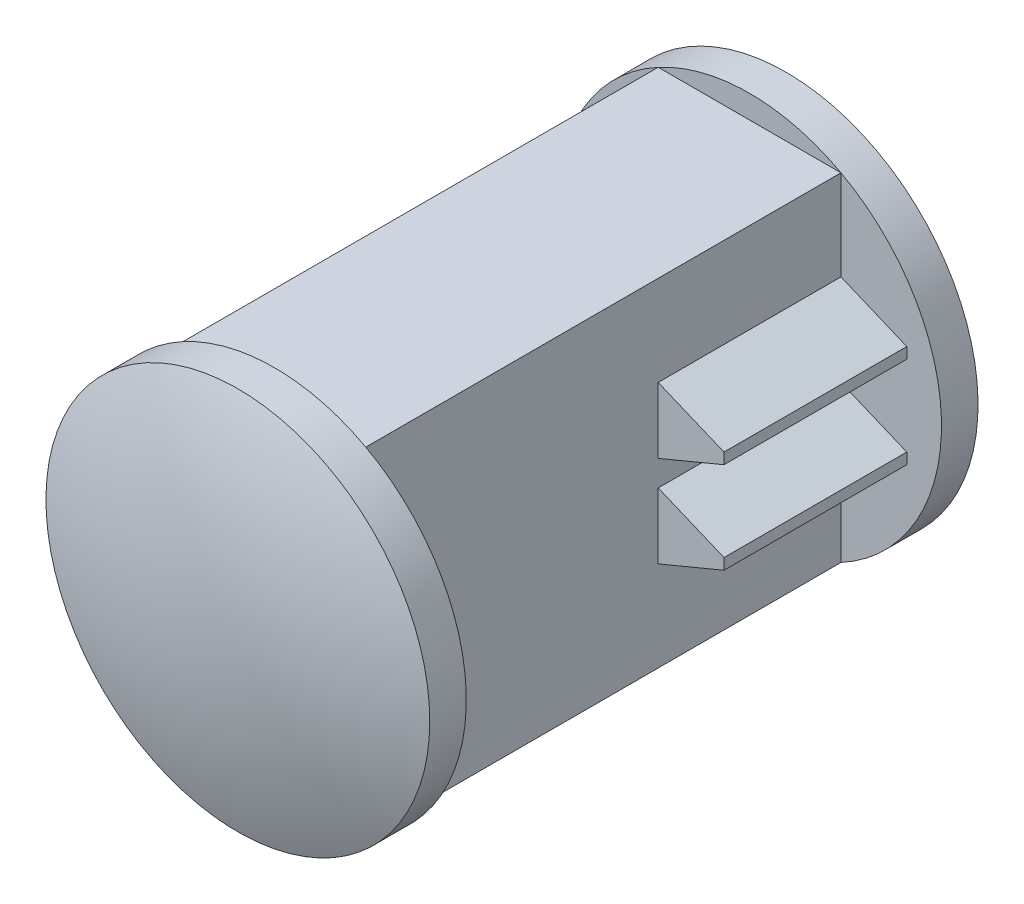
ISO-10303-21;
HEADER;
FILE_DESCRIPTION(('STEP AP214'),'2;1');
FILE_NAME('part.step','',(''),(''),'','','');
FILE_SCHEMA(('AUTOMOTIVE_DESIGN { 1 0 10303 214 1 1 1 1 }'));
ENDSEC;
DATA;
#1=APPLICATION_CONTEXT('core data for automotive mechanical design processes');
#2=APPLICATION_PROTOCOL_DEFINITION('international standard','automotive_design',2000,#1);
#3=PRODUCT_CONTEXT('',#1,'mechanical');
#4=PRODUCT('Part','Part','',(#3));
#5=PRODUCT_RELATED_PRODUCT_CATEGORY('part','',(#4));
#6=PRODUCT_DEFINITION_FORMATION('','',#4);
#7=PRODUCT_DEFINITION_CONTEXT('part definition',#1,'design');
#8=PRODUCT_DEFINITION('design','',#6,#7);
#9=PRODUCT_DEFINITION_SHAPE('','',#8);
#10=(LENGTH_UNIT() NAMED_UNIT(*) SI_UNIT(.MILLI.,.METRE.));
#11=(NAMED_UNIT(*) PLANE_ANGLE_UNIT() SI_UNIT($,.RADIAN.));
#12=(NAMED_UNIT(*) SI_UNIT($,.STERADIAN.) SOLID_ANGLE_UNIT());
#13=UNCERTAINTY_MEASURE_WITH_UNIT(LENGTH_MEASURE(1.E-05),#10,'distance_accuracy_value','');
#14=(GEOMETRIC_REPRESENTATION_CONTEXT(3) GLOBAL_UNCERTAINTY_ASSIGNED_CONTEXT((#13)) GLOBAL_UNIT_ASSIGNED_CONTEXT((#10,
#11,#12)) REPRESENTATION_CONTEXT('',''));
#15=CARTESIAN_POINT('',(0.,0.,0.));
#16=DIRECTION('',(0.,0.,1.));
#17=DIRECTION('',(1.,0.,0.));
#18=AXIS2_PLACEMENT_3D('',#15,#16,#17);
#19=CARTESIAN_POINT('',(2.5,-4.61654632815485,-13.));
#20=DIRECTION('',(-1.,0.,0.));
#21=DIRECTION('',(0.,0.,1.));
#22=AXIS2_PLACEMENT_3D('',#19,#20,#21);
#23=PLANE('',#22);
#24=DIRECTION('',(0.,-1.,0.));
#25=VECTOR('',#24,1.);
#26=CARTESIAN_POINT('',(2.5,-4.61654632815485,-13.));
#27=LINE('',#26,#25);
#28=CARTESIAN_POINT('',(2.5,-2.15,-13.));
#29=VERTEX_POINT('',#28);
#30=CARTESIAN_POINT('',(2.5,-4.61654632815485,-13.));
#31=VERTEX_POINT('',#30);
#32=EDGE_CURVE('E311',#29,#31,#27,.T.);
#33=ORIENTED_EDGE('',*,*,#32,.F.);
#34=DIRECTION('',(0.,0.,-1.));
#35=VECTOR('',#34,1.);
#36=CARTESIAN_POINT('',(2.5,-2.15,-8.));
#37=LINE('',#36,#35);
#38=CARTESIAN_POINT('',(2.5,-2.15,-8.));
#39=VERTEX_POINT('',#38);
#40=EDGE_CURVE('E199',#39,#29,#37,.T.);
#41=ORIENTED_EDGE('',*,*,#40,.F.);
#42=DIRECTION('',(0.,-1.,0.));
#43=VECTOR('',#42,1.);
#44=CARTESIAN_POINT('',(2.5,0.,-8.));
#45=LINE('',#44,#43);
#46=CARTESIAN_POINT('',(2.5,-0.35,-8.));
#47=VERTEX_POINT('',#46);
#48=EDGE_CURVE('E190',#47,#39,#45,.T.);
#49=ORIENTED_EDGE('',*,*,#48,.F.);
#50=DIRECTION('',(0.,0.,-1.));
#51=VECTOR('',#50,1.);
#52=CARTESIAN_POINT('',(2.5,-0.35,-8.));
#53=LINE('',#52,#51);
#54=CARTESIAN_POINT('',(2.5,-0.35,-13.));
#55=VERTEX_POINT('',#54);
#56=EDGE_CURVE('E205',#47,#55,#53,.T.);
#57=ORIENTED_EDGE('',*,*,#56,.T.);
#58=CARTESIAN_POINT('',(2.5,0.349999999999999,-13.));
#59=VERTEX_POINT('',#58);
#60=EDGE_CURVE('E310',#59,#55,#27,.T.);
#61=ORIENTED_EDGE('',*,*,#60,.F.);
#62=DIRECTION('',(0.,0.,-1.));
#63=VECTOR('',#62,1.);
#64=CARTESIAN_POINT('',(2.5,0.35,-8.));
#65=LINE('',#64,#63);
#66=CARTESIAN_POINT('',(2.5,0.35,-8.));
#67=VERTEX_POINT('',#66);
#68=EDGE_CURVE('E228',#67,#59,#65,.T.);
#69=ORIENTED_EDGE('',*,*,#68,.F.);
#70=DIRECTION('',(0.,-1.,0.));
#71=VECTOR('',#70,1.);
#72=CARTESIAN_POINT('',(2.5,0.,-8.));
#73=LINE('',#72,#71);
#74=CARTESIAN_POINT('',(2.5,2.15,-8.));
#75=VERTEX_POINT('',#74);
#76=EDGE_CURVE('E58',#75,#67,#73,.T.);
#77=ORIENTED_EDGE('',*,*,#76,.F.);
#78=DIRECTION('',(0.,0.,-1.));
#79=VECTOR('',#78,1.);
#80=CARTESIAN_POINT('',(2.5,2.15,-8.));
#81=LINE('',#80,#79);
#82=CARTESIAN_POINT('',(2.5,2.15,-13.));
#83=VERTEX_POINT('',#82);
#84=EDGE_CURVE('E231',#75,#83,#81,.T.);
#85=ORIENTED_EDGE('',*,*,#84,.T.);
#86=CARTESIAN_POINT('',(2.5,4.61654632815485,-13.));
#87=VERTEX_POINT('',#86);
#88=EDGE_CURVE('E306',#87,#83,#27,.T.);
#89=ORIENTED_EDGE('',*,*,#88,.F.);
#90=DIRECTION('',(0.,0.,1.));
#91=VECTOR('',#90,1.);
#92=CARTESIAN_POINT('',(2.5,4.61654632815485,-13.));
#93=LINE('',#92,#91);
#94=CARTESIAN_POINT('',(2.5,4.61654632815485,0.));
#95=VERTEX_POINT('',#94);
#96=EDGE_CURVE('E322',#87,#95,#93,.T.);
#97=ORIENTED_EDGE('',*,*,#96,.T.);
#98=DIRECTION('',(0.,-1.,0.));
#99=VECTOR('',#98,1.);
#100=CARTESIAN_POINT('',(2.5,-4.61654632815485,0.));
#101=LINE('',#100,#99);
#102=CARTESIAN_POINT('',(2.5,-4.61654632815485,0.));
#103=VERTEX_POINT('',#102);
#104=EDGE_CURVE('E301',#95,#103,#101,.T.);
#105=ORIENTED_EDGE('',*,*,#104,.T.);
#106=DIRECTION('',(0.,0.,1.));
#107=VECTOR('',#106,1.);
#108=CARTESIAN_POINT('',(2.5,-4.61654632815485,-13.));
#109=LINE('',#108,#107);
#110=EDGE_CURVE('E342',#31,#103,#109,.T.);
#111=ORIENTED_EDGE('',*,*,#110,.F.);
#112=EDGE_LOOP('',(#33,#41,#49,#57,#61,#69,#77,#85,#89,#97,#105,#111));
#113=FACE_BOUND('',#112,.T.);
#114=ADVANCED_FACE('F35',(#113),#23,.F.);
#115=CARTESIAN_POINT('',(0.,0.,-13.));
#116=DIRECTION('',(0.,0.,-1.));
#117=DIRECTION('',(-1.,0.,0.));
#118=AXIS2_PLACEMENT_3D('',#115,#116,#117);
#119=PLANE('',#118);
#120=DIRECTION('',(0.,-1.,0.));
#121=VECTOR('',#120,1.);
#122=CARTESIAN_POINT('',(4.3,0.,-13.));
#123=LINE('',#122,#121);
#124=CARTESIAN_POINT('',(4.3,-1.1,-13.));
#125=VERTEX_POINT('',#124);
#126=CARTESIAN_POINT('',(4.3,-1.4,-13.));
#127=VERTEX_POINT('',#126);
#128=EDGE_CURVE('E50',#125,#127,#123,.T.);
#129=ORIENTED_EDGE('',*,*,#128,.T.);
#130=DIRECTION('',(-0.923076923076923,-0.384615384615384,0.));
#131=VECTOR('',#130,1.);
#132=CARTESIAN_POINT('',(1.13313609467456,-2.71952662721893,-13.));
#133=LINE('',#132,#131);
#134=EDGE_CURVE('E178',#127,#29,#133,.T.);
#135=ORIENTED_EDGE('',*,*,#134,.T.);
#136=ORIENTED_EDGE('',*,*,#32,.T.);
#137=CARTESIAN_POINT('',(0.,0.,-13.));
#138=DIRECTION('',(0.,0.,-1.));
#139=DIRECTION('',(-1.,0.,0.));
#140=AXIS2_PLACEMENT_3D('',#137,#138,#139);
#141=CIRCLE('',#140,5.25);
#142=EDGE_CURVE('E305',#87,#31,#141,.T.);
#143=ORIENTED_EDGE('',*,*,#142,.F.);
#144=ORIENTED_EDGE('',*,*,#88,.T.);
#145=DIRECTION('',(-0.923076923076923,0.384615384615384,0.));
#146=VECTOR('',#145,1.);
#147=CARTESIAN_POINT('',(1.13313609467456,2.71952662721893,-13.));
#148=LINE('',#147,#146);
#149=CARTESIAN_POINT('',(4.3,1.4,-13.));
#150=VERTEX_POINT('',#149);
#151=EDGE_CURVE('E221',#150,#83,#148,.T.);
#152=ORIENTED_EDGE('',*,*,#151,.F.);
#153=DIRECTION('',(0.,1.,0.));
#154=VECTOR('',#153,1.);
#155=CARTESIAN_POINT('',(4.3,0.,-13.));
#156=LINE('',#155,#154);
#157=CARTESIAN_POINT('',(4.3,1.1,-13.));
#158=VERTEX_POINT('',#157);
#159=EDGE_CURVE('E180',#158,#150,#156,.T.);
#160=ORIENTED_EDGE('',*,*,#159,.F.);
#161=DIRECTION('',(0.923076923076923,0.384615384615385,0.));
#162=VECTOR('',#161,1.);
#163=CARTESIAN_POINT('',(0.245562130177515,-0.589349112426036,-13.));
#164=LINE('',#163,#162);
#165=EDGE_CURVE('E213',#59,#158,#164,.T.);
#166=ORIENTED_EDGE('',*,*,#165,.F.);
#167=ORIENTED_EDGE('',*,*,#60,.T.);
#168=DIRECTION('',(0.923076923076923,-0.384615384615385,0.));
#169=VECTOR('',#168,1.);
#170=CARTESIAN_POINT('',(0.245562130177515,0.589349112426036,-13.));
#171=LINE('',#170,#169);
#172=EDGE_CURVE('E191',#55,#125,#171,.T.);
#173=ORIENTED_EDGE('',*,*,#172,.T.);
#174=EDGE_LOOP('',(#129,#135,#136,#143,#144,#152,#160,#166,#167,#173));
#175=FACE_BOUND('',#174,.T.);
#176=ADVANCED_FACE('F382',(#175),#119,.F.);
#177=CARTESIAN_POINT('',(-2.5,-4.61654632815485,-13.));
#178=DIRECTION('',(1.,0.,0.));
#179=DIRECTION('',(0.,0.,-1.));
#180=AXIS2_PLACEMENT_3D('',#177,#178,#179);
#181=PLANE('',#180);
#182=DIRECTION('',(0.,0.,-1.));
#183=VECTOR('',#182,1.);
#184=CARTESIAN_POINT('',(-2.5,-2.15,-8.));
#185=LINE('',#184,#183);
#186=CARTESIAN_POINT('',(-2.5,-2.15,-8.));
#187=VERTEX_POINT('',#186);
#188=CARTESIAN_POINT('',(-2.5,-2.15,-13.));
#189=VERTEX_POINT('',#188);
#190=EDGE_CURVE('E262',#187,#189,#185,.T.);
#191=ORIENTED_EDGE('',*,*,#190,.T.);
#192=DIRECTION('',(0.,1.,0.));
#193=VECTOR('',#192,1.);
#194=CARTESIAN_POINT('',(-2.5,-4.61654632815485,-13.));
#195=LINE('',#194,#193);
#196=CARTESIAN_POINT('',(-2.5,-4.61654632815485,-13.));
#197=VERTEX_POINT('',#196);
#198=EDGE_CURVE('E315',#197,#189,#195,.T.);
#199=ORIENTED_EDGE('',*,*,#198,.F.);
#200=DIRECTION('',(0.,0.,1.));
#201=VECTOR('',#200,1.);
#202=CARTESIAN_POINT('',(-2.5,-4.61654632815485,-13.));
#203=LINE('',#202,#201);
#204=CARTESIAN_POINT('',(-2.5,-4.61654632815485,0.));
#205=VERTEX_POINT('',#204);
#206=EDGE_CURVE('E339',#197,#205,#203,.T.);
#207=ORIENTED_EDGE('',*,*,#206,.T.);
#208=DIRECTION('',(0.,1.,0.));
#209=VECTOR('',#208,1.);
#210=CARTESIAN_POINT('',(-2.5,-4.61654632815485,0.));
#211=LINE('',#210,#209);
#212=CARTESIAN_POINT('',(-2.5,4.61654632815485,0.));
#213=VERTEX_POINT('',#212);
#214=EDGE_CURVE('E328',#205,#213,#211,.T.);
#215=ORIENTED_EDGE('',*,*,#214,.T.);
#216=DIRECTION('',(0.,0.,1.));
#217=VECTOR('',#216,1.);
#218=CARTESIAN_POINT('',(-2.5,4.61654632815485,-13.));
#219=LINE('',#218,#217);
#220=CARTESIAN_POINT('',(-2.5,4.61654632815485,-13.));
#221=VERTEX_POINT('',#220);
#222=EDGE_CURVE('E336',#221,#213,#219,.T.);
#223=ORIENTED_EDGE('',*,*,#222,.F.);
#224=CARTESIAN_POINT('',(-2.5,2.15,-13.));
#225=VERTEX_POINT('',#224);
#226=EDGE_CURVE('E314',#225,#221,#195,.T.);
#227=ORIENTED_EDGE('',*,*,#226,.F.);
#228=DIRECTION('',(0.,0.,-1.));
#229=VECTOR('',#228,1.);
#230=CARTESIAN_POINT('',(-2.5,2.15,-8.));
#231=LINE('',#230,#229);
#232=CARTESIAN_POINT('',(-2.5,2.15,-8.));
#233=VERTEX_POINT('',#232);
#234=EDGE_CURVE('E280',#233,#225,#231,.T.);
#235=ORIENTED_EDGE('',*,*,#234,.F.);
#236=DIRECTION('',(0.,-1.,0.));
#237=VECTOR('',#236,1.);
#238=CARTESIAN_POINT('',(-2.5,0.,-8.));
#239=LINE('',#238,#237);
#240=CARTESIAN_POINT('',(-2.5,0.35,-8.));
#241=VERTEX_POINT('',#240);
#242=EDGE_CURVE('E277',#233,#241,#239,.T.);
#243=ORIENTED_EDGE('',*,*,#242,.T.);
#244=DIRECTION('',(0.,0.,-1.));
#245=VECTOR('',#244,1.);
#246=CARTESIAN_POINT('',(-2.5,0.35,-8.));
#247=LINE('',#246,#245);
#248=CARTESIAN_POINT('',(-2.5,0.35,-13.));
#249=VERTEX_POINT('',#248);
#250=EDGE_CURVE('E289',#241,#249,#247,.T.);
#251=ORIENTED_EDGE('',*,*,#250,.T.);
#252=CARTESIAN_POINT('',(-2.5,-0.350000000000001,-13.));
#253=VERTEX_POINT('',#252);
#254=EDGE_CURVE('E319',#253,#249,#195,.T.);
#255=ORIENTED_EDGE('',*,*,#254,.F.);
#256=DIRECTION('',(0.,0.,-1.));
#257=VECTOR('',#256,1.);
#258=CARTESIAN_POINT('',(-2.5,-0.35,-8.));
#259=LINE('',#258,#257);
#260=CARTESIAN_POINT('',(-2.5,-0.35,-8.));
#261=VERTEX_POINT('',#260);
#262=EDGE_CURVE('E259',#261,#253,#259,.T.);
#263=ORIENTED_EDGE('',*,*,#262,.F.);
#264=DIRECTION('',(0.,1.,0.));
#265=VECTOR('',#264,1.);
#266=CARTESIAN_POINT('',(-2.5,0.,-8.));
#267=LINE('',#266,#265);
#268=EDGE_CURVE('E244',#187,#261,#267,.T.);
#269=ORIENTED_EDGE('',*,*,#268,.F.);
#270=EDGE_LOOP('',(#191,#199,#207,#215,#223,#227,#235,#243,#251,#255,#263,#269));
#271=FACE_BOUND('',#270,.T.);
#272=ADVANCED_FACE('F378',(#271),#181,.F.);
#273=DIRECTION('',(0.923076923076923,-0.384615384615384,0.));
#274=VECTOR('',#273,1.);
#275=CARTESIAN_POINT('',(-1.13313609467456,-2.71952662721893,-13.));
#276=LINE('',#275,#274);
#277=CARTESIAN_POINT('',(-4.3,-1.4,-13.));
#278=VERTEX_POINT('',#277);
#279=EDGE_CURVE('E252',#278,#189,#276,.T.);
#280=ORIENTED_EDGE('',*,*,#279,.F.);
#281=DIRECTION('',(0.,-1.,0.));
#282=VECTOR('',#281,1.);
#283=CARTESIAN_POINT('',(-4.3,0.,-13.));
#284=LINE('',#283,#282);
#285=CARTESIAN_POINT('',(-4.3,-1.1,-13.));
#286=VERTEX_POINT('',#285);
#287=EDGE_CURVE('E236',#286,#278,#284,.T.);
#288=ORIENTED_EDGE('',*,*,#287,.F.);
#289=DIRECTION('',(-0.923076923076923,-0.384615384615385,0.));
#290=VECTOR('',#289,1.);
#291=CARTESIAN_POINT('',(-0.245562130177515,0.589349112426036,-13.));
#292=LINE('',#291,#290);
#293=EDGE_CURVE('E241',#253,#286,#292,.T.);
#294=ORIENTED_EDGE('',*,*,#293,.F.);
#295=ORIENTED_EDGE('',*,*,#254,.T.);
#296=DIRECTION('',(-0.923076923076923,0.384615384615385,0.));
#297=VECTOR('',#296,1.);
#298=CARTESIAN_POINT('',(-0.245562130177515,-0.589349112426036,-13.));
#299=LINE('',#298,#297);
#300=CARTESIAN_POINT('',(-4.3,1.1,-13.));
#301=VERTEX_POINT('',#300);
#302=EDGE_CURVE('E271',#249,#301,#299,.T.);
#303=ORIENTED_EDGE('',*,*,#302,.T.);
#304=DIRECTION('',(0.,1.,0.));
#305=VECTOR('',#304,1.);
#306=CARTESIAN_POINT('',(-4.3,0.,-13.));
#307=LINE('',#306,#305);
#308=CARTESIAN_POINT('',(-4.3,1.4,-13.));
#309=VERTEX_POINT('',#308);
#310=EDGE_CURVE('E283',#301,#309,#307,.T.);
#311=ORIENTED_EDGE('',*,*,#310,.T.);
#312=DIRECTION('',(0.923076923076923,0.384615384615384,0.));
#313=VECTOR('',#312,1.);
#314=CARTESIAN_POINT('',(-1.13313609467456,2.71952662721893,-13.));
#315=LINE('',#314,#313);
#316=EDGE_CURVE('E267',#309,#225,#315,.T.);
#317=ORIENTED_EDGE('',*,*,#316,.T.);
#318=ORIENTED_EDGE('',*,*,#226,.T.);
#319=EDGE_CURVE('E297',#197,#221,#141,.T.);
#320=ORIENTED_EDGE('',*,*,#319,.F.);
#321=ORIENTED_EDGE('',*,*,#198,.T.);
#322=EDGE_LOOP('',(#280,#288,#294,#295,#303,#311,#317,#318,#320,#321));
#323=FACE_BOUND('',#322,.T.);
#324=ADVANCED_FACE('F369',(#323),#119,.F.);
#325=CARTESIAN_POINT('',(0.,0.,0.));
#326=DIRECTION('',(0.,0.,1.));
#327=DIRECTION('',(1.,0.,0.));
#328=AXIS2_PLACEMENT_3D('',#325,#326,#327);
#329=PLANE('',#328);
#330=ORIENTED_EDGE('',*,*,#104,.F.);
#331=CARTESIAN_POINT('',(0.,0.,0.));
#332=DIRECTION('',(0.,0.,1.));
#333=DIRECTION('',(1.,0.,0.));
#334=AXIS2_PLACEMENT_3D('',#331,#332,#333);
#335=CIRCLE('',#334,5.25);
#336=EDGE_CURVE('E344',#103,#95,#335,.T.);
#337=ORIENTED_EDGE('',*,*,#336,.F.);
#338=EDGE_LOOP('',(#330,#337));
#339=FACE_BOUND('',#338,.T.);
#340=ADVANCED_FACE('F366',(#339),#329,.F.);
#341=DIRECTION('',(1.,0.,0.));
#342=VECTOR('',#341,1.);
#343=CARTESIAN_POINT('',(-2.5,4.61654632815485,0.));
#344=LINE('',#343,#342);
#345=EDGE_CURVE('E331',#213,#95,#344,.T.);
#346=ORIENTED_EDGE('',*,*,#345,.F.);
#347=EDGE_CURVE('E43',#95,#213,#335,.T.);
#348=ORIENTED_EDGE('',*,*,#347,.F.);
#349=EDGE_LOOP('',(#346,#348));
#350=FACE_BOUND('',#349,.T.);
#351=ADVANCED_FACE('F368',(#350),#329,.F.);
#352=ORIENTED_EDGE('',*,*,#214,.F.);
#353=EDGE_CURVE('E346',#213,#205,#335,.T.);
#354=ORIENTED_EDGE('',*,*,#353,.F.);
#355=EDGE_LOOP('',(#352,#354));
#356=FACE_BOUND('',#355,.T.);
#357=ADVANCED_FACE('F376',(#356),#329,.F.);
#358=DIRECTION('',(-1.,0.,0.));
#359=VECTOR('',#358,1.);
#360=CARTESIAN_POINT('',(-2.5,-4.61654632815485,0.));
#361=LINE('',#360,#359);
#362=EDGE_CURVE('E325',#103,#205,#361,.T.);
#363=ORIENTED_EDGE('',*,*,#362,.F.);
#364=EDGE_CURVE('E350',#205,#103,#335,.T.);
#365=ORIENTED_EDGE('',*,*,#364,.F.);
#366=EDGE_LOOP('',(#363,#365));
#367=FACE_BOUND('',#366,.T.);
#368=ADVANCED_FACE('F371',(#367),#329,.F.);
#369=CARTESIAN_POINT('',(0.,0.,1.));
#370=DIRECTION('',(0.,0.,-1.));
#371=DIRECTION('',(-1.,0.,0.));
#372=AXIS2_PLACEMENT_3D('',#369,#370,#371);
#373=CYLINDRICAL_SURFACE('',#372,5.25);
#374=CARTESIAN_POINT('',(0.,0.,1.));
#375=DIRECTION('',(0.,0.,1.));
#376=DIRECTION('',(1.,0.,0.));
#377=AXIS2_PLACEMENT_3D('',#374,#375,#376);
#378=CIRCLE('',#377,5.25);
#379=CARTESIAN_POINT('',(5.25,0.,1.));
#380=VERTEX_POINT('',#379);
#381=EDGE_CURVE('E11',#380,#380,#378,.T.);
#382=ORIENTED_EDGE('',*,*,#381,.F.);
#383=EDGE_LOOP('',(#382));
#384=FACE_BOUND('',#383,.T.);
#385=ORIENTED_EDGE('',*,*,#347,.T.);
#386=ORIENTED_EDGE('',*,*,#353,.T.);
#387=ORIENTED_EDGE('',*,*,#364,.T.);
#388=ORIENTED_EDGE('',*,*,#336,.T.);
#389=EDGE_LOOP('',(#385,#386,#387,#388));
#390=FACE_BOUND('',#389,.T.);
#391=ADVANCED_FACE('F354',(#384,#390),#373,.T.);
#392=CARTESIAN_POINT('',(0.,0.,-12.28125));
#393=DIRECTION('',(0.,0.,1.));
#394=DIRECTION('',(1.,0.,0.));
#395=AXIS2_PLACEMENT_3D('',#392,#393,#394);
#396=SPHERICAL_SURFACE('',#395,14.28125);
#397=ORIENTED_EDGE('',*,*,#381,.T.);
#398=EDGE_LOOP('',(#397));
#399=FACE_BOUND('',#398,.T.);
#400=ADVANCED_FACE('F37',(#399),#396,.T.);
#401=CARTESIAN_POINT('',(-2.5,-4.61654632815485,-13.));
#402=DIRECTION('',(0.,1.,0.));
#403=DIRECTION('',(0.,0.,1.));
#404=AXIS2_PLACEMENT_3D('',#401,#402,#403);
#405=PLANE('',#404);
#406=ORIENTED_EDGE('',*,*,#362,.T.);
#407=ORIENTED_EDGE('',*,*,#206,.F.);
#408=DIRECTION('',(-1.,0.,0.));
#409=VECTOR('',#408,1.);
#410=CARTESIAN_POINT('',(-2.5,-4.61654632815485,-13.));
#411=LINE('',#410,#409);
#412=EDGE_CURVE('E309',#31,#197,#411,.T.);
#413=ORIENTED_EDGE('',*,*,#412,.F.);
#414=ORIENTED_EDGE('',*,*,#110,.T.);
#415=EDGE_LOOP('',(#406,#407,#413,#414));
#416=FACE_BOUND('',#415,.T.);
#417=ADVANCED_FACE('F361',(#416),#405,.F.);
#418=CARTESIAN_POINT('',(-2.5,4.61654632815485,-13.));
#419=DIRECTION('',(0.,-1.,0.));
#420=DIRECTION('',(0.,0.,-1.));
#421=AXIS2_PLACEMENT_3D('',#418,#419,#420);
#422=PLANE('',#421);
#423=ORIENTED_EDGE('',*,*,#345,.T.);
#424=ORIENTED_EDGE('',*,*,#96,.F.);
#425=DIRECTION('',(1.,0.,0.));
#426=VECTOR('',#425,1.);
#427=CARTESIAN_POINT('',(-2.5,4.61654632815485,-13.));
#428=LINE('',#427,#426);
#429=EDGE_CURVE('E318',#221,#87,#428,.T.);
#430=ORIENTED_EDGE('',*,*,#429,.F.);
#431=ORIENTED_EDGE('',*,*,#222,.T.);
#432=EDGE_LOOP('',(#423,#424,#430,#431));
#433=FACE_BOUND('',#432,.T.);
#434=ADVANCED_FACE('F394',(#433),#422,.F.);
#435=EDGE_CURVE('E675',#31,#197,#141,.T.);
#436=ORIENTED_EDGE('',*,*,#435,.F.);
#437=ORIENTED_EDGE('',*,*,#412,.T.);
#438=EDGE_LOOP('',(#436,#437));
#439=FACE_BOUND('',#438,.T.);
#440=ADVANCED_FACE('F381',(#439),#119,.F.);
#441=EDGE_CURVE('E302',#221,#87,#141,.T.);
#442=ORIENTED_EDGE('',*,*,#441,.F.);
#443=ORIENTED_EDGE('',*,*,#429,.T.);
#444=EDGE_LOOP('',(#442,#443));
#445=FACE_BOUND('',#444,.T.);
#446=ADVANCED_FACE('F390',(#445),#119,.F.);
#447=CARTESIAN_POINT('',(0.,0.,-14.));
#448=DIRECTION('',(0.,0.,1.));
#449=DIRECTION('',(1.,0.,0.));
#450=AXIS2_PLACEMENT_3D('',#447,#448,#449);
#451=CYLINDRICAL_SURFACE('',#450,5.25);
#452=CARTESIAN_POINT('',(0.,0.,-14.));
#453=DIRECTION('',(0.,0.,-1.));
#454=DIRECTION('',(-1.,0.,0.));
#455=AXIS2_PLACEMENT_3D('',#452,#453,#454);
#456=CIRCLE('',#455,5.25);
#457=CARTESIAN_POINT('',(-5.25,0.,-14.));
#458=VERTEX_POINT('',#457);
#459=EDGE_CURVE('E298',#458,#458,#456,.T.);
#460=ORIENTED_EDGE('',*,*,#459,.F.);
#461=EDGE_LOOP('',(#460));
#462=FACE_BOUND('',#461,.T.);
#463=ORIENTED_EDGE('',*,*,#441,.T.);
#464=ORIENTED_EDGE('',*,*,#142,.T.);
#465=ORIENTED_EDGE('',*,*,#435,.T.);
#466=ORIENTED_EDGE('',*,*,#319,.T.);
#467=EDGE_LOOP('',(#463,#464,#465,#466));
#468=FACE_BOUND('',#467,.T.);
#469=ADVANCED_FACE('F401',(#462,#468),#451,.T.);
#470=CARTESIAN_POINT('',(0.,0.,-14.));
#471=DIRECTION('',(0.,0.,-1.));
#472=DIRECTION('',(-1.,0.,0.));
#473=AXIS2_PLACEMENT_3D('',#470,#471,#472);
#474=PLANE('',#473);
#475=ORIENTED_EDGE('',*,*,#459,.T.);
#476=EDGE_LOOP('',(#475));
#477=FACE_BOUND('',#476,.T.);
#478=ADVANCED_FACE('F403',(#477),#474,.T.);
#479=CARTESIAN_POINT('',(-1.13313609467456,2.71952662721893,-8.));
#480=DIRECTION('',(-0.384615384615384,0.923076923076923,0.));
#481=DIRECTION('',(-0.923076923076923,-0.384615384615384,0.));
#482=AXIS2_PLACEMENT_3D('',#479,#480,#481);
#483=PLANE('',#482);
#484=ORIENTED_EDGE('',*,*,#316,.F.);
#485=DIRECTION('',(0.,0.,-1.));
#486=VECTOR('',#485,1.);
#487=CARTESIAN_POINT('',(-4.3,1.4,-8.));
#488=LINE('',#487,#486);
#489=CARTESIAN_POINT('',(-4.3,1.4,-8.));
#490=VERTEX_POINT('',#489);
#491=EDGE_CURVE('E295',#490,#309,#488,.T.);
#492=ORIENTED_EDGE('',*,*,#491,.F.);
#493=DIRECTION('',(0.923076923076923,0.384615384615384,0.));
#494=VECTOR('',#493,1.);
#495=CARTESIAN_POINT('',(-1.13313609467456,2.71952662721893,-8.));
#496=LINE('',#495,#494);
#497=EDGE_CURVE('E268',#490,#233,#496,.T.);
#498=ORIENTED_EDGE('',*,*,#497,.T.);
#499=ORIENTED_EDGE('',*,*,#234,.T.);
#500=EDGE_LOOP('',(#484,#492,#498,#499));
#501=FACE_BOUND('',#500,.T.);
#502=ADVANCED_FACE('F408',(#501),#483,.T.);
#503=CARTESIAN_POINT('',(-4.3,0.,-8.));
#504=DIRECTION('',(-1.,0.,0.));
#505=DIRECTION('',(0.,-1.,0.));
#506=AXIS2_PLACEMENT_3D('',#503,#504,#505);
#507=PLANE('',#506);
#508=ORIENTED_EDGE('',*,*,#310,.F.);
#509=DIRECTION('',(0.,0.,-1.));
#510=VECTOR('',#509,1.);
#511=CARTESIAN_POINT('',(-4.3,1.1,-8.));
#512=LINE('',#511,#510);
#513=CARTESIAN_POINT('',(-4.3,1.1,-8.));
#514=VERTEX_POINT('',#513);
#515=EDGE_CURVE('E292',#514,#301,#512,.T.);
#516=ORIENTED_EDGE('',*,*,#515,.F.);
#517=DIRECTION('',(0.,1.,0.));
#518=VECTOR('',#517,1.);
#519=CARTESIAN_POINT('',(-4.3,0.,-8.));
#520=LINE('',#519,#518);
#521=EDGE_CURVE('E270',#514,#490,#520,.T.);
#522=ORIENTED_EDGE('',*,*,#521,.T.);
#523=ORIENTED_EDGE('',*,*,#491,.T.);
#524=EDGE_LOOP('',(#508,#516,#522,#523));
#525=FACE_BOUND('',#524,.T.);
#526=ADVANCED_FACE('F412',(#525),#507,.T.);
#527=CARTESIAN_POINT('',(-0.245562130177515,-0.589349112426036,-8.));
#528=DIRECTION('',(-0.384615384615385,-0.923076923076923,0.));
#529=DIRECTION('',(0.923076923076923,-0.384615384615385,0.));
#530=AXIS2_PLACEMENT_3D('',#527,#528,#529);
#531=PLANE('',#530);
#532=ORIENTED_EDGE('',*,*,#302,.F.);
#533=ORIENTED_EDGE('',*,*,#250,.F.);
#534=DIRECTION('',(-0.923076923076923,0.384615384615385,0.));
#535=VECTOR('',#534,1.);
#536=CARTESIAN_POINT('',(-0.245562130177515,-0.589349112426036,-8.));
#537=LINE('',#536,#535);
#538=EDGE_CURVE('E274',#241,#514,#537,.T.);
#539=ORIENTED_EDGE('',*,*,#538,.T.);
#540=ORIENTED_EDGE('',*,*,#515,.T.);
#541=EDGE_LOOP('',(#532,#533,#539,#540));
#542=FACE_BOUND('',#541,.T.);
#543=ADVANCED_FACE('F416',(#542),#531,.T.);
#544=CARTESIAN_POINT('',(0.,0.,-8.));
#545=DIRECTION('',(0.,0.,1.));
#546=DIRECTION('',(1.,0.,0.));
#547=AXIS2_PLACEMENT_3D('',#544,#545,#546);
#548=PLANE('',#547);
#549=ORIENTED_EDGE('',*,*,#497,.F.);
#550=ORIENTED_EDGE('',*,*,#521,.F.);
#551=ORIENTED_EDGE('',*,*,#538,.F.);
#552=ORIENTED_EDGE('',*,*,#242,.F.);
#553=EDGE_LOOP('',(#549,#550,#551,#552));
#554=FACE_BOUND('',#553,.T.);
#555=ADVANCED_FACE('F420',(#554),#548,.T.);
#556=CARTESIAN_POINT('',(-4.3,0.,-8.));
#557=DIRECTION('',(1.,0.,0.));
#558=DIRECTION('',(0.,1.,0.));
#559=AXIS2_PLACEMENT_3D('',#556,#557,#558);
#560=PLANE('',#559);
#561=ORIENTED_EDGE('',*,*,#287,.T.);
#562=DIRECTION('',(0.,0.,-1.));
#563=VECTOR('',#562,1.);
#564=CARTESIAN_POINT('',(-4.3,-1.4,-8.));
#565=LINE('',#564,#563);
#566=CARTESIAN_POINT('',(-4.3,-1.4,-8.));
#567=VERTEX_POINT('',#566);
#568=EDGE_CURVE('E264',#567,#278,#565,.T.);
#569=ORIENTED_EDGE('',*,*,#568,.F.);
#570=DIRECTION('',(0.,-1.,0.));
#571=VECTOR('',#570,1.);
#572=CARTESIAN_POINT('',(-4.3,0.,-8.));
#573=LINE('',#572,#571);
#574=CARTESIAN_POINT('',(-4.3,-1.1,-8.));
#575=VERTEX_POINT('',#574);
#576=EDGE_CURVE('E237',#575,#567,#573,.T.);
#577=ORIENTED_EDGE('',*,*,#576,.F.);
#578=DIRECTION('',(0.,0.,-1.));
#579=VECTOR('',#578,1.);
#580=CARTESIAN_POINT('',(-4.3,-1.1,-8.));
#581=LINE('',#580,#579);
#582=EDGE_CURVE('E249',#575,#286,#581,.T.);
#583=ORIENTED_EDGE('',*,*,#582,.T.);
#584=EDGE_LOOP('',(#561,#569,#577,#583));
#585=FACE_BOUND('',#584,.T.);
#586=ADVANCED_FACE('F424',(#585),#560,.F.);
#587=CARTESIAN_POINT('',(-1.13313609467456,-2.71952662721893,-8.));
#588=DIRECTION('',(0.384615384615384,0.923076923076923,0.));
#589=DIRECTION('',(-0.923076923076923,0.384615384615384,0.));
#590=AXIS2_PLACEMENT_3D('',#587,#588,#589);
#591=PLANE('',#590);
#592=ORIENTED_EDGE('',*,*,#279,.T.);
#593=ORIENTED_EDGE('',*,*,#190,.F.);
#594=DIRECTION('',(0.923076923076923,-0.384615384615384,0.));
#595=VECTOR('',#594,1.);
#596=CARTESIAN_POINT('',(-1.13313609467456,-2.71952662721893,-8.));
#597=LINE('',#596,#595);
#598=EDGE_CURVE('E240',#567,#187,#597,.T.);
#599=ORIENTED_EDGE('',*,*,#598,.F.);
#600=ORIENTED_EDGE('',*,*,#568,.T.);
#601=EDGE_LOOP('',(#592,#593,#599,#600));
#602=FACE_BOUND('',#601,.T.);
#603=ADVANCED_FACE('F428',(#602),#591,.F.);
#604=CARTESIAN_POINT('',(-0.245562130177515,0.589349112426036,-8.));
#605=DIRECTION('',(0.384615384615385,-0.923076923076923,0.));
#606=DIRECTION('',(0.923076923076923,0.384615384615385,0.));
#607=AXIS2_PLACEMENT_3D('',#604,#605,#606);
#608=PLANE('',#607);
#609=ORIENTED_EDGE('',*,*,#293,.T.);
#610=ORIENTED_EDGE('',*,*,#582,.F.);
#611=DIRECTION('',(-0.923076923076923,-0.384615384615385,0.));
#612=VECTOR('',#611,1.);
#613=CARTESIAN_POINT('',(-0.245562130177515,0.589349112426036,-8.));
#614=LINE('',#613,#612);
#615=EDGE_CURVE('E247',#261,#575,#614,.T.);
#616=ORIENTED_EDGE('',*,*,#615,.F.);
#617=ORIENTED_EDGE('',*,*,#262,.T.);
#618=EDGE_LOOP('',(#609,#610,#616,#617));
#619=FACE_BOUND('',#618,.T.);
#620=ADVANCED_FACE('F432',(#619),#608,.F.);
#621=CARTESIAN_POINT('',(0.,0.,-8.));
#622=DIRECTION('',(0.,0.,1.));
#623=DIRECTION('',(1.,0.,0.));
#624=AXIS2_PLACEMENT_3D('',#621,#622,#623);
#625=PLANE('',#624);
#626=ORIENTED_EDGE('',*,*,#576,.T.);
#627=ORIENTED_EDGE('',*,*,#598,.T.);
#628=ORIENTED_EDGE('',*,*,#268,.T.);
#629=ORIENTED_EDGE('',*,*,#615,.T.);
#630=EDGE_LOOP('',(#626,#627,#628,#629));
#631=FACE_BOUND('',#630,.T.);
#632=ADVANCED_FACE('F436',(#631),#625,.T.);
#633=CARTESIAN_POINT('',(4.3,0.,-8.));
#634=DIRECTION('',(-1.,0.,0.));
#635=DIRECTION('',(0.,-1.,0.));
#636=AXIS2_PLACEMENT_3D('',#633,#634,#635);
#637=PLANE('',#636);
#638=ORIENTED_EDGE('',*,*,#159,.T.);
#639=DIRECTION('',(0.,0.,-1.));
#640=VECTOR('',#639,1.);
#641=CARTESIAN_POINT('',(4.3,1.4,-8.));
#642=LINE('',#641,#640);
#643=CARTESIAN_POINT('',(4.3,1.4,-8.));
#644=VERTEX_POINT('',#643);
#645=EDGE_CURVE('E233',#644,#150,#642,.T.);
#646=ORIENTED_EDGE('',*,*,#645,.F.);
#647=DIRECTION('',(0.,1.,0.));
#648=VECTOR('',#647,1.);
#649=CARTESIAN_POINT('',(4.3,0.,-8.));
#650=LINE('',#649,#648);
#651=CARTESIAN_POINT('',(4.3,1.1,-8.));
#652=VERTEX_POINT('',#651);
#653=EDGE_CURVE('E209',#652,#644,#650,.T.);
#654=ORIENTED_EDGE('',*,*,#653,.F.);
#655=DIRECTION('',(0.,0.,-1.));
#656=VECTOR('',#655,1.);
#657=CARTESIAN_POINT('',(4.3,1.1,-8.));
#658=LINE('',#657,#656);
#659=EDGE_CURVE('E218',#652,#158,#658,.T.);
#660=ORIENTED_EDGE('',*,*,#659,.T.);
#661=EDGE_LOOP('',(#638,#646,#654,#660));
#662=FACE_BOUND('',#661,.T.);
#663=ADVANCED_FACE('F440',(#662),#637,.F.);
#664=CARTESIAN_POINT('',(1.13313609467456,2.71952662721893,-8.));
#665=DIRECTION('',(-0.384615384615384,-0.923076923076923,0.));
#666=DIRECTION('',(0.923076923076923,-0.384615384615384,0.));
#667=AXIS2_PLACEMENT_3D('',#664,#665,#666);
#668=PLANE('',#667);
#669=ORIENTED_EDGE('',*,*,#151,.T.);
#670=ORIENTED_EDGE('',*,*,#84,.F.);
#671=DIRECTION('',(-0.923076923076923,0.384615384615384,0.));
#672=VECTOR('',#671,1.);
#673=CARTESIAN_POINT('',(1.13313609467456,2.71952662721893,-8.));
#674=LINE('',#673,#672);
#675=EDGE_CURVE('E212',#644,#75,#674,.T.);
#676=ORIENTED_EDGE('',*,*,#675,.F.);
#677=ORIENTED_EDGE('',*,*,#645,.T.);
#678=EDGE_LOOP('',(#669,#670,#676,#677));
#679=FACE_BOUND('',#678,.T.);
#680=ADVANCED_FACE('F444',(#679),#668,.F.);
#681=CARTESIAN_POINT('',(0.245562130177515,-0.589349112426036,-8.));
#682=DIRECTION('',(-0.384615384615385,0.923076923076923,0.));
#683=DIRECTION('',(-0.923076923076923,-0.384615384615385,0.));
#684=AXIS2_PLACEMENT_3D('',#681,#682,#683);
#685=PLANE('',#684);
#686=ORIENTED_EDGE('',*,*,#165,.T.);
#687=ORIENTED_EDGE('',*,*,#659,.F.);
#688=DIRECTION('',(0.923076923076923,0.384615384615385,0.));
#689=VECTOR('',#688,1.);
#690=CARTESIAN_POINT('',(0.245562130177515,-0.589349112426036,-8.));
#691=LINE('',#690,#689);
#692=EDGE_CURVE('E216',#67,#652,#691,.T.);
#693=ORIENTED_EDGE('',*,*,#692,.F.);
#694=ORIENTED_EDGE('',*,*,#68,.T.);
#695=EDGE_LOOP('',(#686,#687,#693,#694));
#696=FACE_BOUND('',#695,.T.);
#697=ADVANCED_FACE('F448',(#696),#685,.F.);
#698=CARTESIAN_POINT('',(0.,0.,-8.));
#699=DIRECTION('',(0.,0.,1.));
#700=DIRECTION('',(1.,0.,0.));
#701=AXIS2_PLACEMENT_3D('',#698,#699,#700);
#702=PLANE('',#701);
#703=ORIENTED_EDGE('',*,*,#653,.T.);
#704=ORIENTED_EDGE('',*,*,#675,.T.);
#705=ORIENTED_EDGE('',*,*,#76,.T.);
#706=ORIENTED_EDGE('',*,*,#692,.T.);
#707=EDGE_LOOP('',(#703,#704,#705,#706));
#708=FACE_BOUND('',#707,.T.);
#709=ADVANCED_FACE('F452',(#708),#702,.T.);
#710=CARTESIAN_POINT('',(1.13313609467456,-2.71952662721893,-8.));
#711=DIRECTION('',(0.384615384615384,-0.923076923076923,0.));
#712=DIRECTION('',(0.923076923076923,0.384615384615384,0.));
#713=AXIS2_PLACEMENT_3D('',#710,#711,#712);
#714=PLANE('',#713);
#715=ORIENTED_EDGE('',*,*,#134,.F.);
#716=DIRECTION('',(0.,0.,-1.));
#717=VECTOR('',#716,1.);
#718=CARTESIAN_POINT('',(4.3,-1.4,-8.));
#719=LINE('',#718,#717);
#720=CARTESIAN_POINT('',(4.3,-1.4,-8.));
#721=VERTEX_POINT('',#720);
#722=EDGE_CURVE('E172',#721,#127,#719,.T.);
#723=ORIENTED_EDGE('',*,*,#722,.F.);
#724=DIRECTION('',(-0.923076923076923,-0.384615384615384,0.));
#725=VECTOR('',#724,1.);
#726=CARTESIAN_POINT('',(1.13313609467456,-2.71952662721893,-8.));
#727=LINE('',#726,#725);
#728=EDGE_CURVE('E175',#721,#39,#727,.T.);
#729=ORIENTED_EDGE('',*,*,#728,.T.);
#730=ORIENTED_EDGE('',*,*,#40,.T.);
#731=EDGE_LOOP('',(#715,#723,#729,#730));
#732=FACE_BOUND('',#731,.T.);
#733=ADVANCED_FACE('F174',(#732),#714,.T.);
#734=CARTESIAN_POINT('',(4.3,0.,-8.));
#735=DIRECTION('',(1.,0.,0.));
#736=DIRECTION('',(0.,1.,0.));
#737=AXIS2_PLACEMENT_3D('',#734,#735,#736);
#738=PLANE('',#737);
#739=ORIENTED_EDGE('',*,*,#128,.F.);
#740=DIRECTION('',(0.,0.,-1.));
#741=VECTOR('',#740,1.);
#742=CARTESIAN_POINT('',(4.3,-1.1,-8.));
#743=LINE('',#742,#741);
#744=CARTESIAN_POINT('',(4.3,-1.1,-8.));
#745=VERTEX_POINT('',#744);
#746=EDGE_CURVE('E181',#745,#125,#743,.T.);
#747=ORIENTED_EDGE('',*,*,#746,.F.);
#748=DIRECTION('',(0.,-1.,0.));
#749=VECTOR('',#748,1.);
#750=CARTESIAN_POINT('',(4.3,0.,-8.));
#751=LINE('',#750,#749);
#752=EDGE_CURVE('E187',#745,#721,#751,.T.);
#753=ORIENTED_EDGE('',*,*,#752,.T.);
#754=ORIENTED_EDGE('',*,*,#722,.T.);
#755=EDGE_LOOP('',(#739,#747,#753,#754));
#756=FACE_BOUND('',#755,.T.);
#757=ADVANCED_FACE('F193',(#756),#738,.T.);
#758=CARTESIAN_POINT('',(0.245562130177515,0.589349112426036,-8.));
#759=DIRECTION('',(0.384615384615385,0.923076923076923,0.));
#760=DIRECTION('',(-0.923076923076923,0.384615384615385,0.));
#761=AXIS2_PLACEMENT_3D('',#758,#759,#760);
#762=PLANE('',#761);
#763=ORIENTED_EDGE('',*,*,#172,.F.);
#764=ORIENTED_EDGE('',*,*,#56,.F.);
#765=DIRECTION('',(0.923076923076923,-0.384615384615385,0.));
#766=VECTOR('',#765,1.);
#767=CARTESIAN_POINT('',(0.245562130177515,0.589349112426036,-8.));
#768=LINE('',#767,#766);
#769=EDGE_CURVE('E194',#47,#745,#768,.T.);
#770=ORIENTED_EDGE('',*,*,#769,.T.);
#771=ORIENTED_EDGE('',*,*,#746,.T.);
#772=EDGE_LOOP('',(#763,#764,#770,#771));
#773=FACE_BOUND('',#772,.T.);
#774=ADVANCED_FACE('F461',(#773),#762,.T.);
#775=CARTESIAN_POINT('',(0.,0.,-8.));
#776=DIRECTION('',(0.,0.,1.));
#777=DIRECTION('',(1.,0.,0.));
#778=AXIS2_PLACEMENT_3D('',#775,#776,#777);
#779=PLANE('',#778);
#780=ORIENTED_EDGE('',*,*,#728,.F.);
#781=ORIENTED_EDGE('',*,*,#752,.F.);
#782=ORIENTED_EDGE('',*,*,#769,.F.);
#783=ORIENTED_EDGE('',*,*,#48,.T.);
#784=EDGE_LOOP('',(#780,#781,#782,#783));
#785=FACE_BOUND('',#784,.T.);
#786=ADVANCED_FACE('F185',(#785),#779,.T.);
#787=CLOSED_SHELL('',(#114,#176,#272,#324,#340,#351,#357,#368,#391,#400,#417,#434,#440,#446,
#469,#478,#502,#526,#543,#555,#586,#603,#620,#632,#663,#680,#697,#709,#733,#757,#774,#786));
#788=MANIFOLD_SOLID_BREP('B2',#787);
#789=ADVANCED_BREP_SHAPE_REPRESENTATION('',(#18,#788),#14);
#790=SHAPE_DEFINITION_REPRESENTATION(#9,#789);
ENDSEC;
END-ISO-10303-21;
